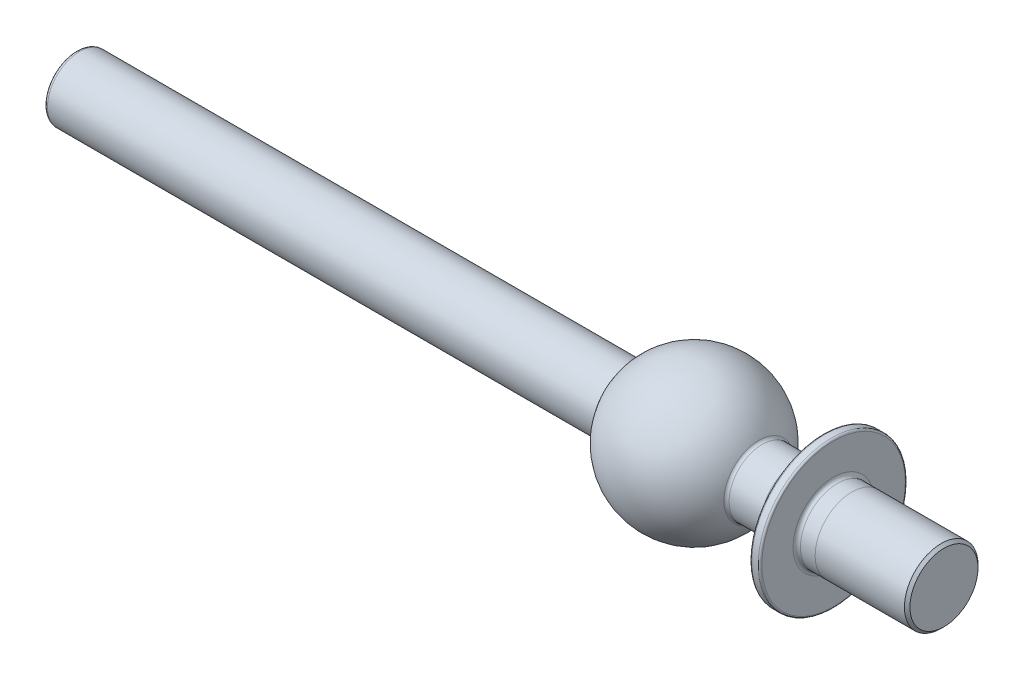
ISO-10303-21;
HEADER;
FILE_DESCRIPTION(('STEP AP214'),'2;1');
FILE_NAME('part.step','',(''),(''),'','','');
FILE_SCHEMA(('AUTOMOTIVE_DESIGN { 1 0 10303 214 1 1 1 1 }'));
ENDSEC;
DATA;
#1=APPLICATION_CONTEXT('core data for automotive mechanical design processes');
#2=APPLICATION_PROTOCOL_DEFINITION('international standard','automotive_design',2000,#1);
#3=PRODUCT_CONTEXT('',#1,'mechanical');
#4=PRODUCT('Part','Part','',(#3));
#5=PRODUCT_RELATED_PRODUCT_CATEGORY('part','',(#4));
#6=PRODUCT_DEFINITION_FORMATION('','',#4);
#7=PRODUCT_DEFINITION_CONTEXT('part definition',#1,'design');
#8=PRODUCT_DEFINITION('design','',#6,#7);
#9=PRODUCT_DEFINITION_SHAPE('','',#8);
#10=(LENGTH_UNIT() NAMED_UNIT(*) SI_UNIT(.MILLI.,.METRE.));
#11=(NAMED_UNIT(*) PLANE_ANGLE_UNIT() SI_UNIT($,.RADIAN.));
#12=(NAMED_UNIT(*) SI_UNIT($,.STERADIAN.) SOLID_ANGLE_UNIT());
#13=UNCERTAINTY_MEASURE_WITH_UNIT(LENGTH_MEASURE(1.E-05),#10,'distance_accuracy_value','');
#14=(GEOMETRIC_REPRESENTATION_CONTEXT(3) GLOBAL_UNCERTAINTY_ASSIGNED_CONTEXT((#13)) GLOBAL_UNIT_ASSIGNED_CONTEXT((#10,
#11,#12)) REPRESENTATION_CONTEXT('',''));
#15=CARTESIAN_POINT('',(0.,0.,0.));
#16=DIRECTION('',(0.,0.,1.));
#17=DIRECTION('',(1.,0.,0.));
#18=AXIS2_PLACEMENT_3D('',#15,#16,#17);
#19=CARTESIAN_POINT('',(0.,0.,0.));
#20=DIRECTION('',(1.,0.,0.));
#21=DIRECTION('',(0.,0.,-1.));
#22=AXIS2_PLACEMENT_3D('',#19,#20,#21);
#23=CYLINDRICAL_SURFACE('',#22,1.);
#24=CARTESIAN_POINT('',(-2.9,0.,0.));
#25=DIRECTION('',(1.,0.,0.));
#26=DIRECTION('',(0.,0.,-1.));
#27=AXIS2_PLACEMENT_3D('',#24,#25,#26);
#28=CIRCLE('',#27,1.);
#29=CARTESIAN_POINT('',(-2.9,0.,-1.));
#30=VERTEX_POINT('',#29);
#31=EDGE_CURVE('E70',#30,#30,#28,.T.);
#32=ORIENTED_EDGE('',*,*,#31,.T.);
#33=EDGE_LOOP('',(#32));
#34=FACE_BOUND('',#33,.T.);
#35=CARTESIAN_POINT('',(-2.5,0.,0.));
#36=DIRECTION('',(1.,0.,0.));
#37=DIRECTION('',(0.,1.,0.));
#38=AXIS2_PLACEMENT_3D('',#35,#36,#37);
#39=CIRCLE('',#38,1.);
#40=CARTESIAN_POINT('',(-2.5,1.,0.));
#41=VERTEX_POINT('',#40);
#42=EDGE_CURVE('E48',#41,#41,#39,.F.);
#43=ORIENTED_EDGE('',*,*,#42,.T.);
#44=EDGE_LOOP('',(#43));
#45=FACE_BOUND('',#44,.T.);
#46=ADVANCED_FACE('F37',(#34,#45),#23,.T.);
#47=CARTESIAN_POINT('',(0.,0.,0.));
#48=DIRECTION('',(1.,0.,0.));
#49=DIRECTION('',(0.,0.,-1.));
#50=AXIS2_PLACEMENT_3D('',#47,#48,#49);
#51=PLANE('',#50);
#52=CARTESIAN_POINT('',(0.,0.,0.));
#53=DIRECTION('',(1.,0.,0.));
#54=DIRECTION('',(0.,0.,-1.));
#55=AXIS2_PLACEMENT_3D('',#52,#53,#54);
#56=CIRCLE('',#55,0.924999999999999);
#57=CARTESIAN_POINT('',(0.,0.,-0.924999999999999));
#58=VERTEX_POINT('',#57);
#59=EDGE_CURVE('E88',#58,#58,#56,.T.);
#60=ORIENTED_EDGE('',*,*,#59,.T.);
#61=EDGE_LOOP('',(#60));
#62=FACE_BOUND('',#61,.T.);
#63=ADVANCED_FACE('F100',(#62),#51,.T.);
#64=CARTESIAN_POINT('',(-6.78605710994918,0.,0.));
#65=DIRECTION('',(1.,0.,0.));
#66=DIRECTION('',(0.,1.,0.));
#67=AXIS2_PLACEMENT_3D('',#64,#65,#66);
#68=SPHERICAL_SURFACE('',#67,2.);
#69=CARTESIAN_POINT('',(-5.02737279446161,0.,0.));
#70=DIRECTION('',(-1.,0.,0.));
#71=DIRECTION('',(0.,0.,1.));
#72=AXIS2_PLACEMENT_3D('',#69,#70,#71);
#73=CIRCLE('',#72,0.952380952380952);
#74=CARTESIAN_POINT('',(-5.02737279446161,0.952380952380949,0.));
#75=VERTEX_POINT('',#74);
#76=EDGE_CURVE('E76',#75,#75,#73,.T.);
#77=CARTESIAN_POINT('',(-8.58449393119145,0.,0.));
#78=DIRECTION('',(-1.,0.,0.));
#79=DIRECTION('',(0.,0.,1.));
#80=AXIS2_PLACEMENT_3D('',#77,#78,#79);
#81=CIRCLE('',#80,0.874999999999999);
#82=CARTESIAN_POINT('',(-8.58449393119145,0.875000000000001,0.));
#83=VERTEX_POINT('',#82);
#84=EDGE_CURVE('E91',#83,#83,#81,.T.);
#85=CARTESIAN_POINT('',(-5.02737279446161,0.952380952380949,0.));
#86=CARTESIAN_POINT('',(-5.04912114602135,0.992547387757574,0.));
#87=CARTESIAN_POINT('',(-5.07224983515722,1.03196597272766,0.));
#88=CARTESIAN_POINT('',(-5.1211495812555,1.10912867177245,0.));
#89=CARTESIAN_POINT('',(-5.14692063821792,1.14687278584716,0.));
#90=CARTESIAN_POINT('',(-5.20098681264358,1.2205077730189,0.));
#91=CARTESIAN_POINT('',(-5.22928193010682,1.25639864611593,0.));
#92=CARTESIAN_POINT('',(-5.28826275206349,1.32615918270106,0.));
#93=CARTESIAN_POINT('',(-5.31894845655692,1.36002884618917,0.));
#94=CARTESIAN_POINT('',(-5.38256665177271,1.42558791507949,0.));
#95=CARTESIAN_POINT('',(-5.41549914249508,1.45727732048171,0.));
#96=CARTESIAN_POINT('',(-5.48345632806691,1.51832720647521,0.));
#97=CARTESIAN_POINT('',(-5.51848102291638,1.54768768706649,0.));
#98=CARTESIAN_POINT('',(-5.59045828114203,1.60394194440624,0.));
#99=CARTESIAN_POINT('',(-5.62741084451821,1.6308357211547,0.));
#100=CARTESIAN_POINT('',(-5.70307044078333,1.68203037733628,0.));
#101=CARTESIAN_POINT('',(-5.74177747367227,1.70633125676941,0.));
#102=CARTESIAN_POINT('',(-5.82076438190369,1.75222608879416,0.));
#103=CARTESIAN_POINT('',(-5.86104425724616,1.77382004138578,0.));
#104=CARTESIAN_POINT('',(-5.94298784172453,1.81419969290443,0.));
#105=CARTESIAN_POINT('',(-5.98465155086043,1.83298539183147,0.));
#106=CARTESIAN_POINT('',(-6.06916730112377,1.86766038637677,0.));
#107=CARTESIAN_POINT('',(-6.11201934225122,1.88354968199504,0.));
#108=CARTESIAN_POINT('',(-6.19871067850464,1.91235731135367,0.));
#109=CARTESIAN_POINT('',(-6.24254997363061,1.92527564509405,0.));
#110=CARTESIAN_POINT('',(-6.33101010734277,1.94808073298889,0.));
#111=CARTESIAN_POINT('',(-6.37563094592896,1.95796748714337,0.));
#112=CARTESIAN_POINT('',(-6.46544478871961,1.97466302347973,0.));
#113=CARTESIAN_POINT('',(-6.51063779292406,1.98147180566163,0.));
#114=CARTESIAN_POINT('',(-6.60138390429361,1.99197944867299,0.));
#115=CARTESIAN_POINT('',(-6.64693701145871,1.99567830950246,0.));
#116=CARTESIAN_POINT('',(-6.73818957635226,1.99994875335593,0.));
#117=CARTESIAN_POINT('',(-6.78388903408072,2.00052033637992,0.));
#118=CARTESIAN_POINT('',(-6.87521986097169,1.9985335425388,0.));
#119=CARTESIAN_POINT('',(-6.92085123013419,1.99597516567369,0.));
#120=CARTESIAN_POINT('',(-7.01183176026121,1.98774045692567,0.));
#121=CARTESIAN_POINT('',(-7.05718092122573,1.98206412504276,0.));
#122=CARTESIAN_POINT('',(-7.14738423955215,1.96762014175384,0.));
#123=CARTESIAN_POINT('',(-7.19223839691406,1.95885249034783,0.));
#124=CARTESIAN_POINT('',(-7.28124123537512,1.93826700914735,0.));
#125=CARTESIAN_POINT('',(-7.32538991647428,1.92644917935288,0.));
#126=CARTESIAN_POINT('',(-7.41277464010924,1.89981879509904,0.));
#127=CARTESIAN_POINT('',(-7.45601068264505,1.88500624063968,0.));
#128=CARTESIAN_POINT('',(-7.54136724930431,1.85245591316343,0.));
#129=CARTESIAN_POINT('',(-7.58348777342777,1.83471814014656,0.));
#130=CARTESIAN_POINT('',(-7.6664156578231,1.79640060787989,0.));
#131=CARTESIAN_POINT('',(-7.70722301809497,1.77582084863009,0.));
#132=CARTESIAN_POINT('',(-7.78733309129966,1.73191591194787,0.));
#133=CARTESIAN_POINT('',(-7.82663580423249,1.70859073451544,0.));
#134=CARTESIAN_POINT('',(-7.90355215930744,1.6593044118638,0.));
#135=CARTESIAN_POINT('',(-7.94116580144957,1.63334326664459,0.));
#136=CARTESIAN_POINT('',(-8.01452751851238,1.57890682849744,0.));
#137=CARTESIAN_POINT('',(-8.05027559343306,1.5504315355695,0.));
#138=CARTESIAN_POINT('',(-8.11973842885782,1.49110041670864,0.));
#139=CARTESIAN_POINT('',(-8.1534531893619,1.46024459077573,0.));
#140=CARTESIAN_POINT('',(-8.21869120741959,1.39629720106694,0.));
#141=CARTESIAN_POINT('',(-8.2502144649732,1.36320563729106,0.));
#142=CARTESIAN_POINT('',(-8.31092150634138,1.29494202030072,0.));
#143=CARTESIAN_POINT('',(-8.34010529015595,1.25976996708627,0.));
#144=CARTESIAN_POINT('',(-8.39599663583062,1.18751052270697,0.));
#145=CARTESIAN_POINT('',(-8.42270419769071,1.15042313154211,0.));
#146=CARTESIAN_POINT('',(-8.47351705671303,1.07450662536075,0.));
#147=CARTESIAN_POINT('',(-8.49762235387526,1.03567751034424,0.));
#148=CARTESIAN_POINT('',(-8.5431202622793,0.956461302260213,0.));
#149=CARTESIAN_POINT('',(-8.56451287352112,0.916074209192698,0.));
#150=CARTESIAN_POINT('',(-8.58449393119145,0.875000000000001,0.));
#151=B_SPLINE_CURVE_WITH_KNOTS('',3,(#85,#86,#87,#88,#89,#90,#91,#92,#93,#94,#95,#96,#97,#98,
#99,#100,#101,#102,#103,#104,#105,#106,#107,#108,#109,#110,#111,#112,#113,#114,#115,#116,#117,
#118,#119,#120,#121,#122,#123,#124,#125,#126,#127,#128,#129,#130,#131,#132,#133,#134,#135,#136,
#137,#138,#139,#140,#141,#142,#143,#144,#145,#146,#147,#148,#149,#150),.UNSPECIFIED.,.F.,.F.,(4,
2,2,2,2,2,2,2,2,2,2,2,2,2,2,2,2,2,2,2,2,2,2,2,2,2,2,2,2,2,2,2,4),(0.,0.137001868371983,
0.274003736743966,0.411005605115949,0.548007473487932,0.685009341859914,0.822011210231898,
0.959013078603881,1.09601494697586,1.23301681534785,1.37001868371983,1.50702055209181,
1.6440224204638,1.78102428883578,1.91802615720776,2.05502802557975,2.19202989395173,
2.32903176232371,2.46603363069569,2.60303549906768,2.74003736743966,2.87703923581164,
3.01404110418363,3.15104297255561,3.28804484092759,3.42504670929958,3.56204857767156,
3.69905044604354,3.83605231441552,3.97305418278751,4.11005605115949,4.24705791953147,
4.38405978790346),.UNSPECIFIED.);
#152=EDGE_CURVE('BSEAM97',#75,#83,#151,.T.);
#153=ORIENTED_EDGE('',*,*,#76,.T.);
#154=ORIENTED_EDGE('',*,*,#84,.F.);
#155=ORIENTED_EDGE('',*,*,#152,.T.);
#156=ORIENTED_EDGE('',*,*,#152,.F.);
#157=EDGE_LOOP('',(#153,#155,#154,#156));
#158=FACE_BOUND('',#157,.T.);
#159=ADVANCED_FACE('F97',(#158),#68,.T.);
#160=CARTESIAN_POINT('',(0.,0.,0.));
#161=DIRECTION('',(1.,0.,0.));
#162=DIRECTION('',(0.,0.,-1.));
#163=AXIS2_PLACEMENT_3D('',#160,#161,#162);
#164=CYLINDRICAL_SURFACE('',#163,0.899999999999999);
#165=CARTESIAN_POINT('',(-4.93943857868724,0.,0.));
#166=DIRECTION('',(-1.,0.,0.));
#167=DIRECTION('',(0.,0.,1.));
#168=AXIS2_PLACEMENT_3D('',#165,#166,#167);
#169=CIRCLE('',#168,0.899999999999999);
#170=CARTESIAN_POINT('',(-4.93943857868724,0.,0.899999999999999));
#171=VERTEX_POINT('',#170);
#172=EDGE_CURVE('E79',#171,#171,#169,.F.);
#173=ORIENTED_EDGE('',*,*,#172,.T.);
#174=EDGE_LOOP('',(#173));
#175=FACE_BOUND('',#174,.T.);
#176=CARTESIAN_POINT('',(-4.05285024505177,0.,0.));
#177=DIRECTION('',(1.,0.,0.));
#178=DIRECTION('',(0.,0.,-1.));
#179=AXIS2_PLACEMENT_3D('',#176,#177,#178);
#180=CIRCLE('',#179,0.899999999999999);
#181=CARTESIAN_POINT('',(-4.05285024505177,0.,-0.899999999999999));
#182=VERTEX_POINT('',#181);
#183=EDGE_CURVE('E82',#182,#182,#180,.F.);
#184=ORIENTED_EDGE('',*,*,#183,.T.);
#185=EDGE_LOOP('',(#184));
#186=FACE_BOUND('',#185,.T.);
#187=ADVANCED_FACE('F99',(#175,#186),#164,.T.);
#188=CARTESIAN_POINT('',(-3.25,0.,0.));
#189=DIRECTION('',(1.,0.,0.));
#190=DIRECTION('',(0.,0.,-1.));
#191=AXIS2_PLACEMENT_3D('',#188,#189,#190);
#192=CONICAL_SURFACE('',#191,2.,0.97237743331636);
#193=CARTESIAN_POINT('',(-3.26488624461449,0.,0.));
#194=DIRECTION('',(-1.,0.,0.));
#195=DIRECTION('',(0.,0.,1.));
#196=AXIS2_PLACEMENT_3D('',#193,#194,#195);
#197=CIRCLE('',#196,1.97816684123207);
#198=CARTESIAN_POINT('',(-3.26488624461449,0.,1.97816684123207));
#199=VERTEX_POINT('',#198);
#200=EDGE_CURVE('E53',#199,#199,#197,.T.);
#201=ORIENTED_EDGE('',*,*,#200,.T.);
#202=EDGE_LOOP('',(#201));
#203=FACE_BOUND('',#202,.T.);
#204=CARTESIAN_POINT('',(-3.97022751077101,0.,0.));
#205=DIRECTION('',(1.,0.,0.));
#206=DIRECTION('',(0.,0.,-1.));
#207=AXIS2_PLACEMENT_3D('',#204,#205,#206);
#208=CIRCLE('',#207,0.943666317535848);
#209=CARTESIAN_POINT('',(-3.97022751077101,0.,-0.943666317535848));
#210=VERTEX_POINT('',#209);
#211=EDGE_CURVE('E73',#210,#210,#208,.T.);
#212=ORIENTED_EDGE('',*,*,#211,.T.);
#213=EDGE_LOOP('',(#212));
#214=FACE_BOUND('',#213,.T.);
#215=ADVANCED_FACE('F107',(#203,#214),#192,.T.);
#216=CARTESIAN_POINT('',(0.,0.,0.));
#217=DIRECTION('',(1.,0.,0.));
#218=DIRECTION('',(0.,0.,-1.));
#219=AXIS2_PLACEMENT_3D('',#216,#217,#218);
#220=CYLINDRICAL_SURFACE('',#219,2.);
#221=CARTESIAN_POINT('',(-3.05,0.,0.));
#222=DIRECTION('',(1.,0.,0.));
#223=DIRECTION('',(0.,0.,-1.));
#224=AXIS2_PLACEMENT_3D('',#221,#222,#223);
#225=CIRCLE('',#224,2.);
#226=CARTESIAN_POINT('',(-3.05,0.,-2.));
#227=VERTEX_POINT('',#226);
#228=EDGE_CURVE('E58',#227,#227,#225,.F.);
#229=ORIENTED_EDGE('',*,*,#228,.T.);
#230=EDGE_LOOP('',(#229));
#231=FACE_BOUND('',#230,.T.);
#232=CARTESIAN_POINT('',(-3.22357487747412,0.,0.));
#233=DIRECTION('',(-1.,0.,0.));
#234=DIRECTION('',(0.,0.,1.));
#235=AXIS2_PLACEMENT_3D('',#232,#233,#234);
#236=CIRCLE('',#235,2.);
#237=CARTESIAN_POINT('',(-3.22357487747412,0.,2.));
#238=VERTEX_POINT('',#237);
#239=EDGE_CURVE('E61',#238,#238,#236,.F.);
#240=ORIENTED_EDGE('',*,*,#239,.T.);
#241=EDGE_LOOP('',(#240));
#242=FACE_BOUND('',#241,.T.);
#243=ADVANCED_FACE('F132',(#231,#242),#220,.T.);
#244=CARTESIAN_POINT('',(-3.,0.999999999999999,0.));
#245=DIRECTION('',(1.,0.,0.));
#246=DIRECTION('',(0.,0.,-1.));
#247=AXIS2_PLACEMENT_3D('',#244,#245,#246);
#248=PLANE('',#247);
#249=CARTESIAN_POINT('',(-3.,0.,0.));
#250=DIRECTION('',(1.,0.,0.));
#251=DIRECTION('',(0.,0.,-1.));
#252=AXIS2_PLACEMENT_3D('',#249,#250,#251);
#253=CIRCLE('',#252,1.95);
#254=CARTESIAN_POINT('',(-3.,0.,-1.95));
#255=VERTEX_POINT('',#254);
#256=EDGE_CURVE('E64',#255,#255,#253,.T.);
#257=ORIENTED_EDGE('',*,*,#256,.T.);
#258=EDGE_LOOP('',(#257));
#259=FACE_BOUND('',#258,.T.);
#260=CARTESIAN_POINT('',(-3.,0.,0.));
#261=DIRECTION('',(1.,0.,0.));
#262=DIRECTION('',(0.,0.,-1.));
#263=AXIS2_PLACEMENT_3D('',#260,#261,#262);
#264=CIRCLE('',#263,1.1);
#265=CARTESIAN_POINT('',(-3.,0.,-1.1));
#266=VERTEX_POINT('',#265);
#267=EDGE_CURVE('E67',#266,#266,#264,.F.);
#268=ORIENTED_EDGE('',*,*,#267,.T.);
#269=EDGE_LOOP('',(#268));
#270=FACE_BOUND('',#269,.T.);
#271=ADVANCED_FACE('F123',(#259,#270),#248,.T.);
#272=ORIENTED_EDGE('',*,*,#42,.F.);
#273=EDGE_LOOP('',(#272));
#274=FACE_BOUND('',#273,.T.);
#275=CARTESIAN_POINT('',(-0.0749999999999995,0.,0.));
#276=DIRECTION('',(1.,0.,0.));
#277=DIRECTION('',(0.,0.,-1.));
#278=AXIS2_PLACEMENT_3D('',#275,#276,#277);
#279=CIRCLE('',#278,1.);
#280=CARTESIAN_POINT('',(-0.0749999999999995,0.,-1.));
#281=VERTEX_POINT('',#280);
#282=EDGE_CURVE('E85',#281,#281,#279,.F.);
#283=ORIENTED_EDGE('',*,*,#282,.T.);
#284=EDGE_LOOP('',(#283));
#285=FACE_BOUND('',#284,.T.);
#286=ADVANCED_FACE('F115',(#274,#285),#23,.T.);
#287=CARTESIAN_POINT('',(0.,0.,0.));
#288=DIRECTION('',(-1.,0.,0.));
#289=DIRECTION('',(0.,0.,1.));
#290=AXIS2_PLACEMENT_3D('',#287,#288,#289);
#291=CONICAL_SURFACE('',#290,0.924999999999999,0.785398163397457);
#292=ORIENTED_EDGE('',*,*,#282,.F.);
#293=EDGE_LOOP('',(#292));
#294=FACE_BOUND('',#293,.T.);
#295=ORIENTED_EDGE('',*,*,#59,.F.);
#296=EDGE_LOOP('',(#295));
#297=FACE_BOUND('',#296,.T.);
#298=ADVANCED_FACE('F122',(#294,#297),#291,.T.);
#299=CARTESIAN_POINT('',(-4.93943857868724,0.,0.));
#300=DIRECTION('',(-1.,0.,0.));
#301=DIRECTION('',(0.,0.,1.));
#302=AXIS2_PLACEMENT_3D('',#299,#300,#301);
#303=TOROIDAL_SURFACE('',#302,0.999999999999999,0.1);
#304=ORIENTED_EDGE('',*,*,#76,.F.);
#305=EDGE_LOOP('',(#304));
#306=FACE_BOUND('',#305,.T.);
#307=ORIENTED_EDGE('',*,*,#172,.F.);
#308=EDGE_LOOP('',(#307));
#309=FACE_BOUND('',#308,.T.);
#310=ADVANCED_FACE('F129',(#306,#309),#303,.F.);
#311=CARTESIAN_POINT('',(-4.05285024505177,0.,0.));
#312=DIRECTION('',(1.,0.,0.));
#313=DIRECTION('',(0.,0.,-1.));
#314=AXIS2_PLACEMENT_3D('',#311,#312,#313);
#315=TOROIDAL_SURFACE('',#314,0.999999999999999,0.1);
#316=ORIENTED_EDGE('',*,*,#183,.F.);
#317=EDGE_LOOP('',(#316));
#318=FACE_BOUND('',#317,.T.);
#319=ORIENTED_EDGE('',*,*,#211,.F.);
#320=EDGE_LOOP('',(#319));
#321=FACE_BOUND('',#320,.T.);
#322=ADVANCED_FACE('F154',(#318,#321),#315,.F.);
#323=CARTESIAN_POINT('',(-2.9,0.,0.));
#324=DIRECTION('',(1.,0.,0.));
#325=DIRECTION('',(0.,0.,-1.));
#326=AXIS2_PLACEMENT_3D('',#323,#324,#325);
#327=TOROIDAL_SURFACE('',#326,1.1,0.1);
#328=ORIENTED_EDGE('',*,*,#267,.F.);
#329=EDGE_LOOP('',(#328));
#330=FACE_BOUND('',#329,.T.);
#331=ORIENTED_EDGE('',*,*,#31,.F.);
#332=EDGE_LOOP('',(#331));
#333=FACE_BOUND('',#332,.T.);
#334=ADVANCED_FACE('F156',(#330,#333),#327,.F.);
#335=CARTESIAN_POINT('',(-3.05,0.,0.));
#336=DIRECTION('',(1.,0.,0.));
#337=DIRECTION('',(0.,0.,-1.));
#338=AXIS2_PLACEMENT_3D('',#335,#336,#337);
#339=TOROIDAL_SURFACE('',#338,1.95,0.05);
#340=ORIENTED_EDGE('',*,*,#228,.F.);
#341=EDGE_LOOP('',(#340));
#342=FACE_BOUND('',#341,.T.);
#343=ORIENTED_EDGE('',*,*,#256,.F.);
#344=EDGE_LOOP('',(#343));
#345=FACE_BOUND('',#344,.T.);
#346=ADVANCED_FACE('F163',(#342,#345),#339,.T.);
#347=CARTESIAN_POINT('',(-3.22357487747412,0.,0.));
#348=DIRECTION('',(-1.,0.,0.));
#349=DIRECTION('',(0.,0.,1.));
#350=AXIS2_PLACEMENT_3D('',#347,#348,#349);
#351=TOROIDAL_SURFACE('',#350,1.95,0.05);
#352=ORIENTED_EDGE('',*,*,#200,.F.);
#353=EDGE_LOOP('',(#352));
#354=FACE_BOUND('',#353,.T.);
#355=ORIENTED_EDGE('',*,*,#239,.F.);
#356=EDGE_LOOP('',(#355));
#357=FACE_BOUND('',#356,.T.);
#358=ADVANCED_FACE('F171',(#354,#357),#351,.T.);
#359=CARTESIAN_POINT('',(-23.5844939311914,0.,0.));
#360=DIRECTION('',(1.,0.,0.));
#361=DIRECTION('',(0.,0.,-1.));
#362=AXIS2_PLACEMENT_3D('',#359,#360,#361);
#363=CYLINDRICAL_SURFACE('',#362,0.874999999999999);
#364=CARTESIAN_POINT('',(-23.4844939311914,0.,0.));
#365=DIRECTION('',(-1.,0.,0.));
#366=DIRECTION('',(0.,0.,1.));
#367=AXIS2_PLACEMENT_3D('',#364,#365,#366);
#368=CIRCLE('',#367,0.874999999999999);
#369=CARTESIAN_POINT('',(-23.4844939311914,0.,0.874999999999999));
#370=VERTEX_POINT('',#369);
#371=EDGE_CURVE('E10',#370,#370,#368,.F.);
#372=ORIENTED_EDGE('',*,*,#371,.T.);
#373=EDGE_LOOP('',(#372));
#374=FACE_BOUND('',#373,.T.);
#375=ORIENTED_EDGE('',*,*,#84,.T.);
#376=EDGE_LOOP('',(#375));
#377=FACE_BOUND('',#376,.T.);
#378=ADVANCED_FACE('F95',(#374,#377),#363,.T.);
#379=CARTESIAN_POINT('',(-23.5844939311914,0.,0.));
#380=DIRECTION('',(-1.,0.,0.));
#381=DIRECTION('',(0.,0.,1.));
#382=AXIS2_PLACEMENT_3D('',#379,#380,#381);
#383=PLANE('',#382);
#384=CARTESIAN_POINT('',(-23.5844939311914,0.,0.));
#385=DIRECTION('',(-1.,0.,0.));
#386=DIRECTION('',(0.,0.,1.));
#387=AXIS2_PLACEMENT_3D('',#384,#385,#386);
#388=CIRCLE('',#387,0.774999999999999);
#389=CARTESIAN_POINT('',(-23.5844939311914,0.,0.774999999999999));
#390=VERTEX_POINT('',#389);
#391=EDGE_CURVE('E44',#390,#390,#388,.T.);
#392=ORIENTED_EDGE('',*,*,#391,.T.);
#393=EDGE_LOOP('',(#392));
#394=FACE_BOUND('',#393,.T.);
#395=ADVANCED_FACE('F178',(#394),#383,.T.);
#396=CARTESIAN_POINT('',(-23.4844939311914,0.,0.));
#397=DIRECTION('',(-1.,0.,0.));
#398=DIRECTION('',(0.,0.,1.));
#399=AXIS2_PLACEMENT_3D('',#396,#397,#398);
#400=TOROIDAL_SURFACE('',#399,0.774999999999999,0.1);
#401=ORIENTED_EDGE('',*,*,#371,.F.);
#402=EDGE_LOOP('',(#401));
#403=FACE_BOUND('',#402,.T.);
#404=ORIENTED_EDGE('',*,*,#391,.F.);
#405=EDGE_LOOP('',(#404));
#406=FACE_BOUND('',#405,.T.);
#407=ADVANCED_FACE('F39',(#403,#406),#400,.T.);
#408=CLOSED_SHELL('',(#46,#63,#159,#187,#215,#243,#271,#286,#298,#310,#322,#334,#346,#358,#378,
#395,#407));
#409=MANIFOLD_SOLID_BREP('B2',#408);
#410=ADVANCED_BREP_SHAPE_REPRESENTATION('',(#18,#409),#14);
#411=SHAPE_DEFINITION_REPRESENTATION(#9,#410);
ENDSEC;
END-ISO-10303-21;
